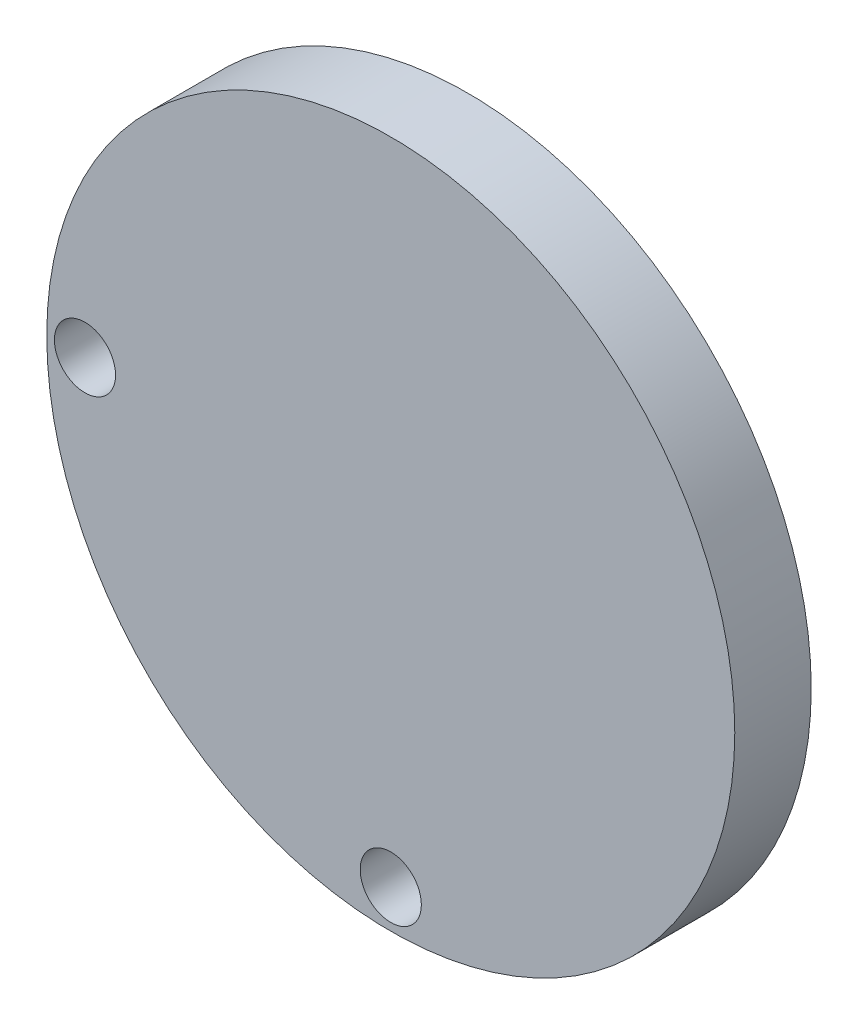
ISO-10303-21;
HEADER;
FILE_DESCRIPTION(('STEP AP214'),'2;1');
FILE_NAME('part.step','',(''),(''),'','','');
FILE_SCHEMA(('AUTOMOTIVE_DESIGN { 1 0 10303 214 1 1 1 1 }'));
ENDSEC;
DATA;
#1=APPLICATION_CONTEXT('core data for automotive mechanical design processes');
#2=APPLICATION_PROTOCOL_DEFINITION('international standard','automotive_design',2000,#1);
#3=PRODUCT_CONTEXT('',#1,'mechanical');
#4=PRODUCT('Part','Part','',(#3));
#5=PRODUCT_RELATED_PRODUCT_CATEGORY('part','',(#4));
#6=PRODUCT_DEFINITION_FORMATION('','',#4);
#7=PRODUCT_DEFINITION_CONTEXT('part definition',#1,'design');
#8=PRODUCT_DEFINITION('design','',#6,#7);
#9=PRODUCT_DEFINITION_SHAPE('','',#8);
#10=(LENGTH_UNIT() NAMED_UNIT(*) SI_UNIT(.MILLI.,.METRE.));
#11=(NAMED_UNIT(*) PLANE_ANGLE_UNIT() SI_UNIT($,.RADIAN.));
#12=(NAMED_UNIT(*) SI_UNIT($,.STERADIAN.) SOLID_ANGLE_UNIT());
#13=UNCERTAINTY_MEASURE_WITH_UNIT(LENGTH_MEASURE(1.E-05),#10,'distance_accuracy_value','');
#14=(GEOMETRIC_REPRESENTATION_CONTEXT(3) GLOBAL_UNCERTAINTY_ASSIGNED_CONTEXT((#13)) GLOBAL_UNIT_ASSIGNED_CONTEXT((#10,
#11,#12)) REPRESENTATION_CONTEXT('',''));
#15=CARTESIAN_POINT('',(0.,0.,0.));
#16=DIRECTION('',(0.,0.,1.));
#17=DIRECTION('',(1.,0.,0.));
#18=AXIS2_PLACEMENT_3D('',#15,#16,#17);
#19=CARTESIAN_POINT('',(0.,0.,5.));
#20=DIRECTION('',(0.,0.,-1.));
#21=DIRECTION('',(-1.,0.,0.));
#22=AXIS2_PLACEMENT_3D('',#19,#20,#21);
#23=CYLINDRICAL_SURFACE('',#22,45.);
#24=CARTESIAN_POINT('',(0.,0.,5.));
#25=DIRECTION('',(0.,0.,1.));
#26=DIRECTION('',(1.,0.,0.));
#27=AXIS2_PLACEMENT_3D('',#24,#25,#26);
#28=CIRCLE('',#27,45.);
#29=CARTESIAN_POINT('',(45.,0.,5.));
#30=VERTEX_POINT('',#29);
#31=EDGE_CURVE('E10',#30,#30,#28,.T.);
#32=ORIENTED_EDGE('',*,*,#31,.F.);
#33=EDGE_LOOP('',(#32));
#34=FACE_BOUND('',#33,.T.);
#35=CARTESIAN_POINT('',(0.,0.,-5.));
#36=DIRECTION('',(0.,0.,1.));
#37=DIRECTION('',(1.,0.,0.));
#38=AXIS2_PLACEMENT_3D('',#35,#36,#37);
#39=CIRCLE('',#38,45.);
#40=CARTESIAN_POINT('',(45.,0.,-5.));
#41=VERTEX_POINT('',#40);
#42=EDGE_CURVE('E34',#41,#41,#39,.T.);
#43=ORIENTED_EDGE('',*,*,#42,.T.);
#44=EDGE_LOOP('',(#43));
#45=FACE_BOUND('',#44,.T.);
#46=ADVANCED_FACE('F31',(#34,#45),#23,.T.);
#47=CARTESIAN_POINT('',(0.,0.,5.));
#48=DIRECTION('',(0.,0.,1.));
#49=DIRECTION('',(1.,0.,0.));
#50=AXIS2_PLACEMENT_3D('',#47,#48,#49);
#51=PLANE('',#50);
#52=CARTESIAN_POINT('',(-40.,0.,5.));
#53=DIRECTION('',(0.,0.,1.));
#54=DIRECTION('',(1.,0.,0.));
#55=AXIS2_PLACEMENT_3D('',#52,#53,#54);
#56=CIRCLE('',#55,4.);
#57=CARTESIAN_POINT('',(-36.,0.,5.));
#58=VERTEX_POINT('',#57);
#59=EDGE_CURVE('E49',#58,#58,#56,.T.);
#60=ORIENTED_EDGE('',*,*,#59,.F.);
#61=EDGE_LOOP('',(#60));
#62=FACE_BOUND('',#61,.T.);
#63=CARTESIAN_POINT('',(0.,-40.,5.));
#64=DIRECTION('',(0.,0.,1.));
#65=DIRECTION('',(1.,0.,0.));
#66=AXIS2_PLACEMENT_3D('',#63,#64,#65);
#67=CIRCLE('',#66,4.);
#68=CARTESIAN_POINT('',(4.00000000000001,-40.,5.));
#69=VERTEX_POINT('',#68);
#70=EDGE_CURVE('E43',#69,#69,#67,.T.);
#71=ORIENTED_EDGE('',*,*,#70,.F.);
#72=EDGE_LOOP('',(#71));
#73=FACE_BOUND('',#72,.T.);
#74=ORIENTED_EDGE('',*,*,#31,.T.);
#75=EDGE_LOOP('',(#74));
#76=FACE_BOUND('',#75,.T.);
#77=ADVANCED_FACE('F65',(#62,#73,#76),#51,.T.);
#78=CARTESIAN_POINT('',(0.,0.,-5.));
#79=DIRECTION('',(0.,0.,1.));
#80=DIRECTION('',(1.,0.,0.));
#81=AXIS2_PLACEMENT_3D('',#78,#79,#80);
#82=PLANE('',#81);
#83=CARTESIAN_POINT('',(-40.,0.,-5.));
#84=DIRECTION('',(0.,0.,1.));
#85=DIRECTION('',(1.,0.,0.));
#86=AXIS2_PLACEMENT_3D('',#83,#84,#85);
#87=CIRCLE('',#86,4.);
#88=CARTESIAN_POINT('',(-36.,0.,-5.));
#89=VERTEX_POINT('',#88);
#90=EDGE_CURVE('E41',#89,#89,#87,.T.);
#91=ORIENTED_EDGE('',*,*,#90,.T.);
#92=EDGE_LOOP('',(#91));
#93=FACE_BOUND('',#92,.T.);
#94=CARTESIAN_POINT('',(0.,-40.,-5.));
#95=DIRECTION('',(0.,0.,1.));
#96=DIRECTION('',(1.,0.,0.));
#97=AXIS2_PLACEMENT_3D('',#94,#95,#96);
#98=CIRCLE('',#97,4.);
#99=CARTESIAN_POINT('',(4.00000000000001,-40.,-5.));
#100=VERTEX_POINT('',#99);
#101=EDGE_CURVE('E46',#100,#100,#98,.T.);
#102=ORIENTED_EDGE('',*,*,#101,.T.);
#103=EDGE_LOOP('',(#102));
#104=FACE_BOUND('',#103,.T.);
#105=ORIENTED_EDGE('',*,*,#42,.F.);
#106=EDGE_LOOP('',(#105));
#107=FACE_BOUND('',#106,.T.);
#108=ADVANCED_FACE('F55',(#93,#104,#107),#82,.F.);
#109=CARTESIAN_POINT('',(0.,-40.,-5.));
#110=DIRECTION('',(0.,0.,1.));
#111=DIRECTION('',(1.,0.,0.));
#112=AXIS2_PLACEMENT_3D('',#109,#110,#111);
#113=CYLINDRICAL_SURFACE('',#112,4.);
#114=ORIENTED_EDGE('',*,*,#101,.F.);
#115=EDGE_LOOP('',(#114));
#116=FACE_BOUND('',#115,.T.);
#117=ORIENTED_EDGE('',*,*,#70,.T.);
#118=EDGE_LOOP('',(#117));
#119=FACE_BOUND('',#118,.T.);
#120=ADVANCED_FACE('F61',(#116,#119),#113,.F.);
#121=CARTESIAN_POINT('',(-40.,0.,-5.));
#122=DIRECTION('',(0.,0.,1.));
#123=DIRECTION('',(1.,0.,0.));
#124=AXIS2_PLACEMENT_3D('',#121,#122,#123);
#125=CYLINDRICAL_SURFACE('',#124,4.);
#126=ORIENTED_EDGE('',*,*,#90,.F.);
#127=EDGE_LOOP('',(#126));
#128=FACE_BOUND('',#127,.T.);
#129=ORIENTED_EDGE('',*,*,#59,.T.);
#130=EDGE_LOOP('',(#129));
#131=FACE_BOUND('',#130,.T.);
#132=ADVANCED_FACE('F58',(#128,#131),#125,.F.);
#133=CLOSED_SHELL('',(#46,#77,#108,#120,#132));
#134=MANIFOLD_SOLID_BREP('B2',#133);
#135=ADVANCED_BREP_SHAPE_REPRESENTATION('',(#18,#134),#14);
#136=SHAPE_DEFINITION_REPRESENTATION(#9,#135);
ENDSEC;
END-ISO-10303-21;
